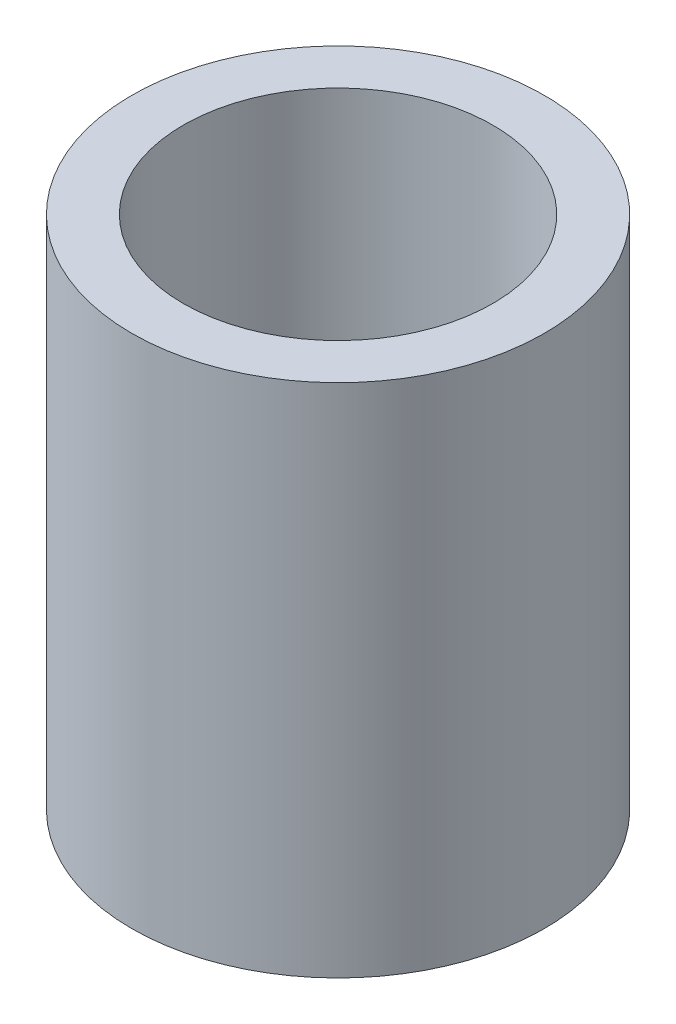
ISO-10303-21;
HEADER;
FILE_DESCRIPTION(('STEP AP214'),'2;1');
FILE_NAME('part.step','',(''),(''),'','','');
FILE_SCHEMA(('AUTOMOTIVE_DESIGN { 1 0 10303 214 1 1 1 1 }'));
ENDSEC;
DATA;
#1=APPLICATION_CONTEXT('core data for automotive mechanical design processes');
#2=APPLICATION_PROTOCOL_DEFINITION('international standard','automotive_design',2000,#1);
#3=PRODUCT_CONTEXT('',#1,'mechanical');
#4=PRODUCT('Part','Part','',(#3));
#5=PRODUCT_RELATED_PRODUCT_CATEGORY('part','',(#4));
#6=PRODUCT_DEFINITION_FORMATION('','',#4);
#7=PRODUCT_DEFINITION_CONTEXT('part definition',#1,'design');
#8=PRODUCT_DEFINITION('design','',#6,#7);
#9=PRODUCT_DEFINITION_SHAPE('','',#8);
#10=(LENGTH_UNIT() NAMED_UNIT(*) SI_UNIT(.MILLI.,.METRE.));
#11=(NAMED_UNIT(*) PLANE_ANGLE_UNIT() SI_UNIT($,.RADIAN.));
#12=(NAMED_UNIT(*) SI_UNIT($,.STERADIAN.) SOLID_ANGLE_UNIT());
#13=UNCERTAINTY_MEASURE_WITH_UNIT(LENGTH_MEASURE(1.E-05),#10,'distance_accuracy_value','');
#14=(GEOMETRIC_REPRESENTATION_CONTEXT(3) GLOBAL_UNCERTAINTY_ASSIGNED_CONTEXT((#13)) GLOBAL_UNIT_ASSIGNED_CONTEXT((#10,
#11,#12)) REPRESENTATION_CONTEXT('',''));
#15=CARTESIAN_POINT('',(0.,0.,0.));
#16=DIRECTION('',(0.,0.,1.));
#17=DIRECTION('',(1.,0.,0.));
#18=AXIS2_PLACEMENT_3D('',#15,#16,#17);
#19=CARTESIAN_POINT('',(0.,15.875,0.));
#20=DIRECTION('',(0.,-1.,0.));
#21=DIRECTION('',(0.,0.,-1.));
#22=AXIS2_PLACEMENT_3D('',#19,#20,#21);
#23=CYLINDRICAL_SURFACE('',#22,6.35);
#24=CARTESIAN_POINT('',(0.,15.875,0.));
#25=DIRECTION('',(0.,1.,0.));
#26=DIRECTION('',(0.,0.,1.));
#27=AXIS2_PLACEMENT_3D('',#24,#25,#26);
#28=CIRCLE('',#27,6.35);
#29=CARTESIAN_POINT('',(0.,15.875,6.35));
#30=VERTEX_POINT('',#29);
#31=EDGE_CURVE('E10',#30,#30,#28,.T.);
#32=ORIENTED_EDGE('',*,*,#31,.F.);
#33=EDGE_LOOP('',(#32));
#34=FACE_BOUND('',#33,.T.);
#35=CARTESIAN_POINT('',(0.,0.,0.));
#36=DIRECTION('',(0.,1.,0.));
#37=DIRECTION('',(0.,0.,1.));
#38=AXIS2_PLACEMENT_3D('',#35,#36,#37);
#39=CIRCLE('',#38,6.35);
#40=CARTESIAN_POINT('',(0.,0.,6.35));
#41=VERTEX_POINT('',#40);
#42=EDGE_CURVE('E34',#41,#41,#39,.T.);
#43=ORIENTED_EDGE('',*,*,#42,.T.);
#44=EDGE_LOOP('',(#43));
#45=FACE_BOUND('',#44,.T.);
#46=ADVANCED_FACE('F31',(#34,#45),#23,.T.);
#47=CARTESIAN_POINT('',(0.,15.875,0.));
#48=DIRECTION('',(0.,1.,0.));
#49=DIRECTION('',(0.,0.,1.));
#50=AXIS2_PLACEMENT_3D('',#47,#48,#49);
#51=PLANE('',#50);
#52=CARTESIAN_POINT('',(0.,15.875,0.));
#53=DIRECTION('',(0.,1.,0.));
#54=DIRECTION('',(0.,0.,1.));
#55=AXIS2_PLACEMENT_3D('',#52,#53,#54);
#56=CIRCLE('',#55,4.7625);
#57=CARTESIAN_POINT('',(0.,15.875,4.7625));
#58=VERTEX_POINT('',#57);
#59=EDGE_CURVE('E43',#58,#58,#56,.T.);
#60=ORIENTED_EDGE('',*,*,#59,.F.);
#61=EDGE_LOOP('',(#60));
#62=FACE_BOUND('',#61,.T.);
#63=ORIENTED_EDGE('',*,*,#31,.T.);
#64=EDGE_LOOP('',(#63));
#65=FACE_BOUND('',#64,.T.);
#66=ADVANCED_FACE('F58',(#62,#65),#51,.T.);
#67=CARTESIAN_POINT('',(0.,0.,0.));
#68=DIRECTION('',(0.,1.,0.));
#69=DIRECTION('',(0.,0.,1.));
#70=AXIS2_PLACEMENT_3D('',#67,#68,#69);
#71=PLANE('',#70);
#72=CARTESIAN_POINT('',(0.,0.,0.));
#73=DIRECTION('',(0.,1.,0.));
#74=DIRECTION('',(0.,0.,1.));
#75=AXIS2_PLACEMENT_3D('',#72,#73,#74);
#76=CIRCLE('',#75,4.7625);
#77=CARTESIAN_POINT('',(0.,0.,4.7625));
#78=VERTEX_POINT('',#77);
#79=EDGE_CURVE('E41',#78,#78,#76,.T.);
#80=ORIENTED_EDGE('',*,*,#79,.T.);
#81=EDGE_LOOP('',(#80));
#82=FACE_BOUND('',#81,.T.);
#83=ORIENTED_EDGE('',*,*,#42,.F.);
#84=EDGE_LOOP('',(#83));
#85=FACE_BOUND('',#84,.T.);
#86=ADVANCED_FACE('F49',(#82,#85),#71,.F.);
#87=CARTESIAN_POINT('',(0.,0.,0.));
#88=DIRECTION('',(0.,1.,0.));
#89=DIRECTION('',(0.,0.,1.));
#90=AXIS2_PLACEMENT_3D('',#87,#88,#89);
#91=CYLINDRICAL_SURFACE('',#90,4.7625);
#92=ORIENTED_EDGE('',*,*,#79,.F.);
#93=EDGE_LOOP('',(#92));
#94=FACE_BOUND('',#93,.T.);
#95=ORIENTED_EDGE('',*,*,#59,.T.);
#96=EDGE_LOOP('',(#95));
#97=FACE_BOUND('',#96,.T.);
#98=ADVANCED_FACE('F52',(#94,#97),#91,.F.);
#99=CLOSED_SHELL('',(#46,#66,#86,#98));
#100=MANIFOLD_SOLID_BREP('B2',#99);
#101=ADVANCED_BREP_SHAPE_REPRESENTATION('',(#18,#100),#14);
#102=SHAPE_DEFINITION_REPRESENTATION(#9,#101);
ENDSEC;
END-ISO-10303-21;
